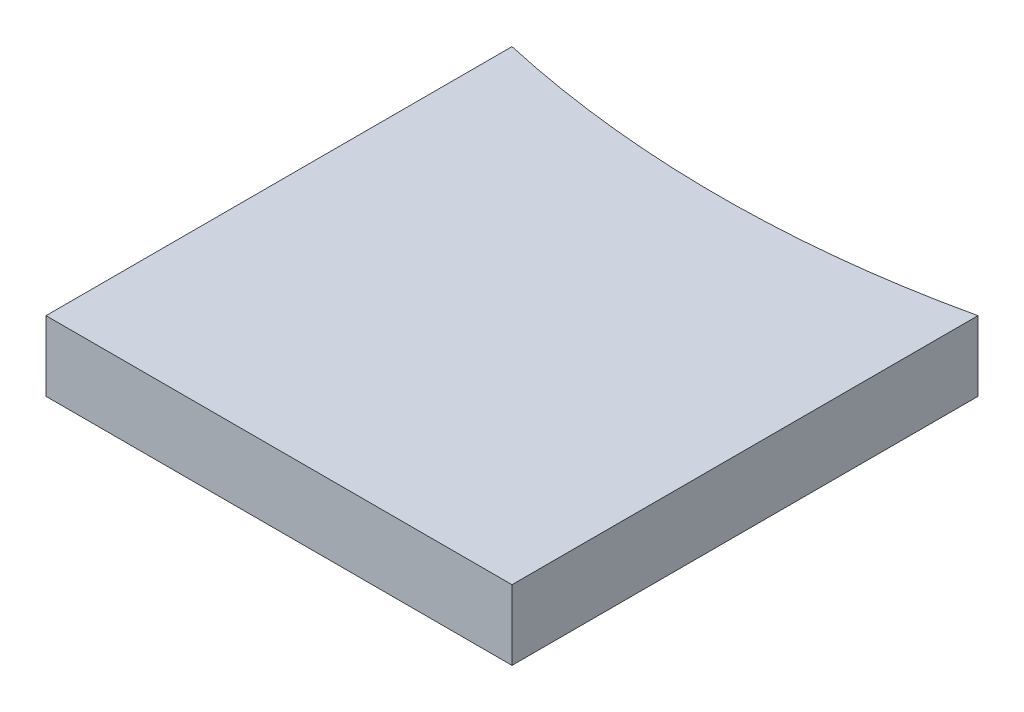
ISO-10303-21;
HEADER;
FILE_DESCRIPTION(('STEP AP214'),'2;1');
FILE_NAME('part.step','',(''),(''),'','','');
FILE_SCHEMA(('AUTOMOTIVE_DESIGN { 1 0 10303 214 1 1 1 1 }'));
ENDSEC;
DATA;
#1=APPLICATION_CONTEXT('core data for automotive mechanical design processes');
#2=APPLICATION_PROTOCOL_DEFINITION('international standard','automotive_design',2000,#1);
#3=PRODUCT_CONTEXT('',#1,'mechanical');
#4=PRODUCT('Part','Part','',(#3));
#5=PRODUCT_RELATED_PRODUCT_CATEGORY('part','',(#4));
#6=PRODUCT_DEFINITION_FORMATION('','',#4);
#7=PRODUCT_DEFINITION_CONTEXT('part definition',#1,'design');
#8=PRODUCT_DEFINITION('design','',#6,#7);
#9=PRODUCT_DEFINITION_SHAPE('','',#8);
#10=(LENGTH_UNIT() NAMED_UNIT(*) SI_UNIT(.MILLI.,.METRE.));
#11=(NAMED_UNIT(*) PLANE_ANGLE_UNIT() SI_UNIT($,.RADIAN.));
#12=(NAMED_UNIT(*) SI_UNIT($,.STERADIAN.) SOLID_ANGLE_UNIT());
#13=UNCERTAINTY_MEASURE_WITH_UNIT(LENGTH_MEASURE(1.E-05),#10,'distance_accuracy_value','');
#14=(GEOMETRIC_REPRESENTATION_CONTEXT(3) GLOBAL_UNCERTAINTY_ASSIGNED_CONTEXT((#13)) GLOBAL_UNIT_ASSIGNED_CONTEXT((#10,
#11,#12)) REPRESENTATION_CONTEXT('',''));
#15=CARTESIAN_POINT('',(0.,0.,0.));
#16=DIRECTION('',(0.,0.,1.));
#17=DIRECTION('',(1.,0.,0.));
#18=AXIS2_PLACEMENT_3D('',#15,#16,#17);
#19=CARTESIAN_POINT('',(0.,3.,0.));
#20=DIRECTION('',(1.,0.,0.));
#21=DIRECTION('',(0.,0.,-1.));
#22=AXIS2_PLACEMENT_3D('',#19,#20,#21);
#23=PLANE('',#22);
#24=DIRECTION('',(0.,0.,1.));
#25=VECTOR('',#24,1.);
#26=CARTESIAN_POINT('',(0.,0.,0.));
#27=LINE('',#26,#25);
#28=CARTESIAN_POINT('',(0.,0.,-20.));
#29=VERTEX_POINT('',#28);
#30=CARTESIAN_POINT('',(0.,0.,0.));
#31=VERTEX_POINT('',#30);
#32=EDGE_CURVE('E96',#29,#31,#27,.T.);
#33=ORIENTED_EDGE('',*,*,#32,.T.);
#34=DIRECTION('',(0.,-1.,0.));
#35=VECTOR('',#34,1.);
#36=CARTESIAN_POINT('',(0.,3.,0.));
#37=LINE('',#36,#35);
#38=CARTESIAN_POINT('',(0.,3.,0.));
#39=VERTEX_POINT('',#38);
#40=EDGE_CURVE('E11',#39,#31,#37,.T.);
#41=ORIENTED_EDGE('',*,*,#40,.F.);
#42=DIRECTION('',(0.,0.,1.));
#43=VECTOR('',#42,1.);
#44=CARTESIAN_POINT('',(0.,3.,0.));
#45=LINE('',#44,#43);
#46=CARTESIAN_POINT('',(0.,3.,-20.));
#47=VERTEX_POINT('',#46);
#48=EDGE_CURVE('E84',#47,#39,#45,.T.);
#49=ORIENTED_EDGE('',*,*,#48,.F.);
#50=DIRECTION('',(0.,-1.,0.));
#51=VECTOR('',#50,1.);
#52=CARTESIAN_POINT('',(0.,3.,-20.));
#53=LINE('',#52,#51);
#54=EDGE_CURVE('E92',#47,#29,#53,.T.);
#55=ORIENTED_EDGE('',*,*,#54,.T.);
#56=EDGE_LOOP('',(#33,#41,#49,#55));
#57=FACE_BOUND('',#56,.T.);
#58=ADVANCED_FACE('F33',(#57),#23,.F.);
#59=CARTESIAN_POINT('',(0.,3.,0.));
#60=DIRECTION('',(0.,0.,-1.));
#61=DIRECTION('',(-1.,0.,0.));
#62=AXIS2_PLACEMENT_3D('',#59,#60,#61);
#63=PLANE('',#62);
#64=DIRECTION('',(1.,0.,0.));
#65=VECTOR('',#64,1.);
#66=CARTESIAN_POINT('',(0.,0.,0.));
#67=LINE('',#66,#65);
#68=CARTESIAN_POINT('',(20.,0.,0.));
#69=VERTEX_POINT('',#68);
#70=EDGE_CURVE('E88',#31,#69,#67,.T.);
#71=ORIENTED_EDGE('',*,*,#70,.T.);
#72=DIRECTION('',(0.,-1.,0.));
#73=VECTOR('',#72,1.);
#74=CARTESIAN_POINT('',(20.,3.,0.));
#75=LINE('',#74,#73);
#76=CARTESIAN_POINT('',(20.,3.,0.));
#77=VERTEX_POINT('',#76);
#78=EDGE_CURVE('E41',#77,#69,#75,.T.);
#79=ORIENTED_EDGE('',*,*,#78,.F.);
#80=DIRECTION('',(1.,0.,0.));
#81=VECTOR('',#80,1.);
#82=CARTESIAN_POINT('',(0.,3.,0.));
#83=LINE('',#82,#81);
#84=EDGE_CURVE('E79',#39,#77,#83,.T.);
#85=ORIENTED_EDGE('',*,*,#84,.F.);
#86=ORIENTED_EDGE('',*,*,#40,.T.);
#87=EDGE_LOOP('',(#71,#79,#85,#86));
#88=FACE_BOUND('',#87,.T.);
#89=ADVANCED_FACE('F87',(#88),#63,.F.);
#90=CARTESIAN_POINT('',(20.,3.,0.));
#91=DIRECTION('',(-1.,0.,0.));
#92=DIRECTION('',(0.,0.,1.));
#93=AXIS2_PLACEMENT_3D('',#90,#91,#92);
#94=PLANE('',#93);
#95=DIRECTION('',(0.,0.,-1.));
#96=VECTOR('',#95,1.);
#97=CARTESIAN_POINT('',(20.,0.,0.));
#98=LINE('',#97,#96);
#99=CARTESIAN_POINT('',(20.,0.,-20.));
#100=VERTEX_POINT('',#99);
#101=EDGE_CURVE('E66',#69,#100,#98,.T.);
#102=ORIENTED_EDGE('',*,*,#101,.T.);
#103=DIRECTION('',(0.,-1.,0.));
#104=VECTOR('',#103,1.);
#105=CARTESIAN_POINT('',(20.,3.,-20.));
#106=LINE('',#105,#104);
#107=CARTESIAN_POINT('',(20.,3.,-20.));
#108=VERTEX_POINT('',#107);
#109=EDGE_CURVE('E89',#108,#100,#106,.T.);
#110=ORIENTED_EDGE('',*,*,#109,.F.);
#111=DIRECTION('',(0.,0.,-1.));
#112=VECTOR('',#111,1.);
#113=CARTESIAN_POINT('',(20.,3.,0.));
#114=LINE('',#113,#112);
#115=EDGE_CURVE('E82',#77,#108,#114,.T.);
#116=ORIENTED_EDGE('',*,*,#115,.F.);
#117=ORIENTED_EDGE('',*,*,#78,.T.);
#118=EDGE_LOOP('',(#102,#110,#116,#117));
#119=FACE_BOUND('',#118,.T.);
#120=ADVANCED_FACE('F90',(#119),#94,.F.);
#121=CARTESIAN_POINT('',(10.,3.,-64.4101570286033));
#122=DIRECTION('',(0.,-1.,0.));
#123=DIRECTION('',(0.,0.,-1.));
#124=AXIS2_PLACEMENT_3D('',#121,#122,#123);
#125=CYLINDRICAL_SURFACE('',#124,45.5221050403559);
#126=CARTESIAN_POINT('',(10.,0.,-64.4101570286033));
#127=DIRECTION('',(0.,-1.,0.));
#128=DIRECTION('',(0.,0.,1.));
#129=AXIS2_PLACEMENT_3D('',#126,#127,#128);
#130=CIRCLE('',#129,45.5221050403559);
#131=EDGE_CURVE('E72',#100,#29,#130,.T.);
#132=ORIENTED_EDGE('',*,*,#131,.T.);
#133=ORIENTED_EDGE('',*,*,#54,.F.);
#134=CARTESIAN_POINT('',(10.,3.,-64.4101570286033));
#135=DIRECTION('',(0.,-1.,0.));
#136=DIRECTION('',(0.,0.,1.));
#137=AXIS2_PLACEMENT_3D('',#134,#135,#136);
#138=CIRCLE('',#137,45.5221050403559);
#139=EDGE_CURVE('E49',#108,#47,#138,.T.);
#140=ORIENTED_EDGE('',*,*,#139,.F.);
#141=ORIENTED_EDGE('',*,*,#109,.T.);
#142=EDGE_LOOP('',(#132,#133,#140,#141));
#143=FACE_BOUND('',#142,.T.);
#144=ADVANCED_FACE('F103',(#143),#125,.F.);
#145=CARTESIAN_POINT('',(10.,3.,-64.4101570286033));
#146=DIRECTION('',(0.,1.,0.));
#147=DIRECTION('',(0.,0.,1.));
#148=AXIS2_PLACEMENT_3D('',#145,#146,#147);
#149=PLANE('',#148);
#150=ORIENTED_EDGE('',*,*,#48,.T.);
#151=ORIENTED_EDGE('',*,*,#84,.T.);
#152=ORIENTED_EDGE('',*,*,#115,.T.);
#153=ORIENTED_EDGE('',*,*,#139,.T.);
#154=EDGE_LOOP('',(#150,#151,#152,#153));
#155=FACE_BOUND('',#154,.T.);
#156=ADVANCED_FACE('F80',(#155),#149,.T.);
#157=CARTESIAN_POINT('',(10.,0.,-64.4101570286033));
#158=DIRECTION('',(0.,1.,0.));
#159=DIRECTION('',(0.,0.,1.));
#160=AXIS2_PLACEMENT_3D('',#157,#158,#159);
#161=PLANE('',#160);
#162=ORIENTED_EDGE('',*,*,#32,.F.);
#163=ORIENTED_EDGE('',*,*,#131,.F.);
#164=ORIENTED_EDGE('',*,*,#101,.F.);
#165=ORIENTED_EDGE('',*,*,#70,.F.);
#166=EDGE_LOOP('',(#162,#163,#164,#165));
#167=FACE_BOUND('',#166,.T.);
#168=ADVANCED_FACE('F106',(#167),#161,.F.);
#169=CLOSED_SHELL('',(#58,#89,#120,#144,#156,#168));
#170=MANIFOLD_SOLID_BREP('B2',#169);
#171=ADVANCED_BREP_SHAPE_REPRESENTATION('',(#18,#170),#14);
#172=SHAPE_DEFINITION_REPRESENTATION(#9,#171);
ENDSEC;
END-ISO-10303-21;
